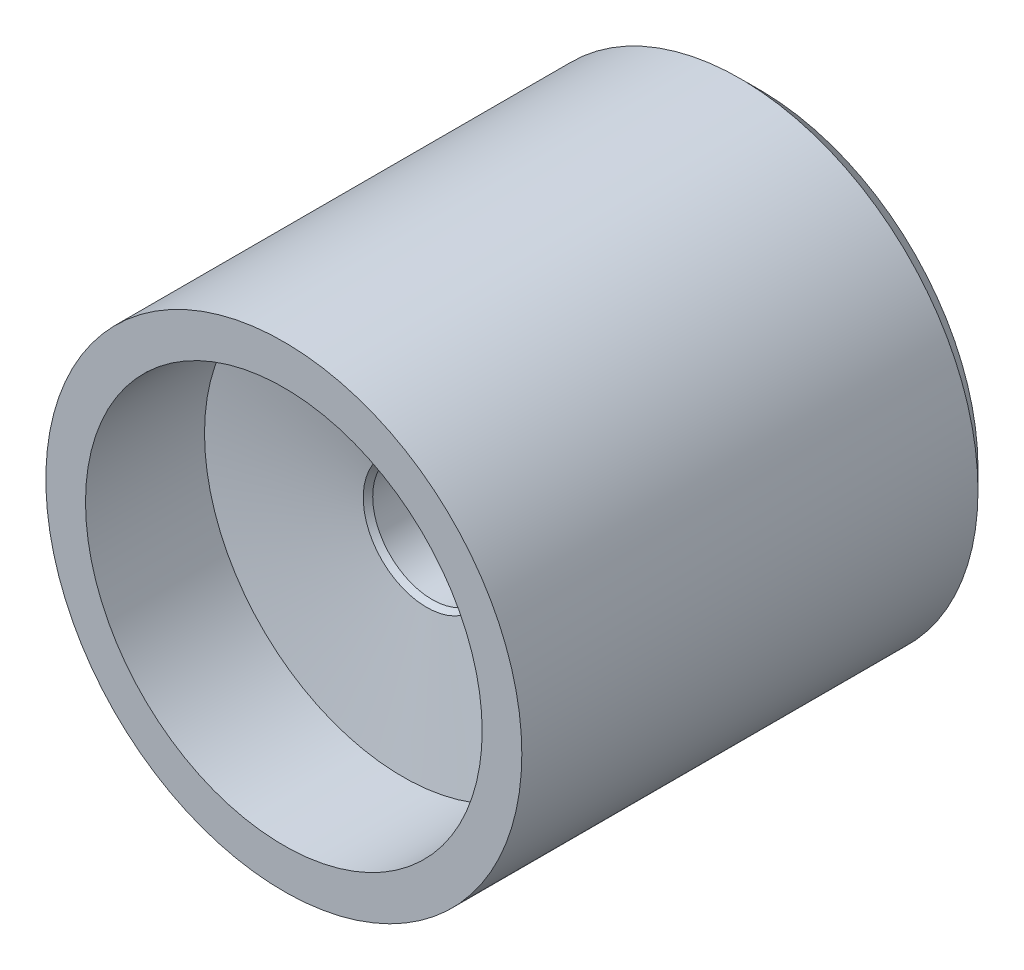
ISO-10303-21;
HEADER;
FILE_DESCRIPTION(('STEP AP214'),'2;1');
FILE_NAME('part.step','',(''),(''),'','','');
FILE_SCHEMA(('AUTOMOTIVE_DESIGN { 1 0 10303 214 1 1 1 1 }'));
ENDSEC;
DATA;
#1=APPLICATION_CONTEXT('core data for automotive mechanical design processes');
#2=APPLICATION_PROTOCOL_DEFINITION('international standard','automotive_design',2000,#1);
#3=PRODUCT_CONTEXT('',#1,'mechanical');
#4=PRODUCT('Part','Part','',(#3));
#5=PRODUCT_RELATED_PRODUCT_CATEGORY('part','',(#4));
#6=PRODUCT_DEFINITION_FORMATION('','',#4);
#7=PRODUCT_DEFINITION_CONTEXT('part definition',#1,'design');
#8=PRODUCT_DEFINITION('design','',#6,#7);
#9=PRODUCT_DEFINITION_SHAPE('','',#8);
#10=(LENGTH_UNIT() NAMED_UNIT(*) SI_UNIT(.MILLI.,.METRE.));
#11=(NAMED_UNIT(*) PLANE_ANGLE_UNIT() SI_UNIT($,.RADIAN.));
#12=(NAMED_UNIT(*) SI_UNIT($,.STERADIAN.) SOLID_ANGLE_UNIT());
#13=UNCERTAINTY_MEASURE_WITH_UNIT(LENGTH_MEASURE(1.E-05),#10,'distance_accuracy_value','');
#14=(GEOMETRIC_REPRESENTATION_CONTEXT(3) GLOBAL_UNCERTAINTY_ASSIGNED_CONTEXT((#13)) GLOBAL_UNIT_ASSIGNED_CONTEXT((#10,
#11,#12)) REPRESENTATION_CONTEXT('',''));
#15=CARTESIAN_POINT('',(0.,0.,0.));
#16=DIRECTION('',(0.,0.,1.));
#17=DIRECTION('',(1.,0.,0.));
#18=AXIS2_PLACEMENT_3D('',#15,#16,#17);
#19=CARTESIAN_POINT('',(0.,0.,12.));
#20=DIRECTION('',(0.,0.,-1.));
#21=DIRECTION('',(-1.,0.,0.));
#22=AXIS2_PLACEMENT_3D('',#19,#20,#21);
#23=CYLINDRICAL_SURFACE('',#22,6.);
#24=CARTESIAN_POINT('',(0.,0.,0.5));
#25=DIRECTION('',(0.,0.,1.));
#26=DIRECTION('',(1.,0.,0.));
#27=AXIS2_PLACEMENT_3D('',#24,#25,#26);
#28=CIRCLE('',#27,6.);
#29=CARTESIAN_POINT('',(6.,0.,0.5));
#30=VERTEX_POINT('',#29);
#31=EDGE_CURVE('E41',#30,#30,#28,.T.);
#32=ORIENTED_EDGE('',*,*,#31,.T.);
#33=EDGE_LOOP('',(#32));
#34=FACE_BOUND('',#33,.T.);
#35=CARTESIAN_POINT('',(0.,0.,12.));
#36=DIRECTION('',(0.,0.,1.));
#37=DIRECTION('',(1.,0.,0.));
#38=AXIS2_PLACEMENT_3D('',#35,#36,#37);
#39=CIRCLE('',#38,6.);
#40=CARTESIAN_POINT('',(6.,0.,12.));
#41=VERTEX_POINT('',#40);
#42=EDGE_CURVE('E54',#41,#41,#39,.T.);
#43=ORIENTED_EDGE('',*,*,#42,.F.);
#44=EDGE_LOOP('',(#43));
#45=FACE_BOUND('',#44,.T.);
#46=ADVANCED_FACE('F33',(#34,#45),#23,.T.);
#47=CARTESIAN_POINT('',(0.,0.,12.));
#48=DIRECTION('',(0.,0.,1.));
#49=DIRECTION('',(1.,0.,0.));
#50=AXIS2_PLACEMENT_3D('',#47,#48,#49);
#51=PLANE('',#50);
#52=CARTESIAN_POINT('',(0.,0.,12.));
#53=DIRECTION('',(0.,0.,1.));
#54=DIRECTION('',(1.,0.,0.));
#55=AXIS2_PLACEMENT_3D('',#52,#53,#54);
#56=CIRCLE('',#55,5.);
#57=CARTESIAN_POINT('',(5.,0.,12.));
#58=VERTEX_POINT('',#57);
#59=EDGE_CURVE('E63',#58,#58,#56,.T.);
#60=ORIENTED_EDGE('',*,*,#59,.F.);
#61=EDGE_LOOP('',(#60));
#62=FACE_BOUND('',#61,.T.);
#63=ORIENTED_EDGE('',*,*,#42,.T.);
#64=EDGE_LOOP('',(#63));
#65=FACE_BOUND('',#64,.T.);
#66=ADVANCED_FACE('F69',(#62,#65),#51,.T.);
#67=CARTESIAN_POINT('',(0.,0.,0.));
#68=DIRECTION('',(0.,0.,1.));
#69=DIRECTION('',(1.,0.,0.));
#70=AXIS2_PLACEMENT_3D('',#67,#68,#69);
#71=PLANE('',#70);
#72=CARTESIAN_POINT('',(0.,0.,0.));
#73=DIRECTION('',(0.,0.,1.));
#74=DIRECTION('',(1.,0.,0.));
#75=AXIS2_PLACEMENT_3D('',#72,#73,#74);
#76=CIRCLE('',#75,5.5);
#77=CARTESIAN_POINT('',(5.5,0.,0.));
#78=VERTEX_POINT('',#77);
#79=EDGE_CURVE('E10',#78,#78,#76,.F.);
#80=ORIENTED_EDGE('',*,*,#79,.T.);
#81=EDGE_LOOP('',(#80));
#82=FACE_BOUND('',#81,.T.);
#83=ADVANCED_FACE('F72',(#82),#71,.F.);
#84=CARTESIAN_POINT('',(0.,0.,3.5));
#85=DIRECTION('',(0.,0.,-1.));
#86=DIRECTION('',(-1.,0.,0.));
#87=AXIS2_PLACEMENT_3D('',#84,#85,#86);
#88=PLANE('',#87);
#89=CARTESIAN_POINT('',(0.,0.,3.5));
#90=DIRECTION('',(0.,0.,1.));
#91=DIRECTION('',(1.,0.,0.));
#92=AXIS2_PLACEMENT_3D('',#89,#90,#91);
#93=CIRCLE('',#92,1.5);
#94=CARTESIAN_POINT('',(1.5,0.,3.5));
#95=VERTEX_POINT('',#94);
#96=EDGE_CURVE('E57',#95,#95,#93,.T.);
#97=ORIENTED_EDGE('',*,*,#96,.T.);
#98=EDGE_LOOP('',(#97));
#99=FACE_BOUND('',#98,.T.);
#100=ADVANCED_FACE('F102',(#99),#88,.F.);
#101=CARTESIAN_POINT('',(0.,0.,12.));
#102=DIRECTION('',(0.,0.,1.));
#103=DIRECTION('',(1.,0.,0.));
#104=AXIS2_PLACEMENT_3D('',#101,#102,#103);
#105=CYLINDRICAL_SURFACE('',#104,1.5);
#106=CARTESIAN_POINT('',(0.,0.,8.25957526233819));
#107=DIRECTION('',(0.,0.,-1.));
#108=DIRECTION('',(-1.,0.,0.));
#109=AXIS2_PLACEMENT_3D('',#106,#107,#108);
#110=CIRCLE('',#109,1.5);
#111=CARTESIAN_POINT('',(-1.5,0.,8.25957526233819));
#112=VERTEX_POINT('',#111);
#113=EDGE_CURVE('E49',#112,#112,#110,.F.);
#114=ORIENTED_EDGE('',*,*,#113,.T.);
#115=EDGE_LOOP('',(#114));
#116=FACE_BOUND('',#115,.T.);
#117=ORIENTED_EDGE('',*,*,#96,.F.);
#118=EDGE_LOOP('',(#117));
#119=FACE_BOUND('',#118,.T.);
#120=ADVANCED_FACE('F99',(#116,#119),#105,.F.);
#121=CARTESIAN_POINT('',(0.,0.,9.));
#122=DIRECTION('',(0.,0.,1.));
#123=DIRECTION('',(1.,0.,0.));
#124=AXIS2_PLACEMENT_3D('',#121,#122,#123);
#125=CONICAL_SURFACE('',#124,5.,1.39626340159546);
#126=CARTESIAN_POINT('',(0.,0.,8.40022038528705));
#127=DIRECTION('',(0.,0.,-1.));
#128=DIRECTION('',(-1.,0.,0.));
#129=AXIS2_PLACEMENT_3D('',#126,#127,#128);
#130=CIRCLE('',#129,1.59848077530122);
#131=CARTESIAN_POINT('',(1.59848077530122,0.,8.40022038528705));
#132=VERTEX_POINT('',#131);
#133=EDGE_CURVE('E45',#132,#132,#130,.T.);
#134=CARTESIAN_POINT('',(0.,0.,9.));
#135=DIRECTION('',(0.,0.,1.));
#136=DIRECTION('',(1.,0.,0.));
#137=AXIS2_PLACEMENT_3D('',#134,#135,#136);
#138=CIRCLE('',#137,5.);
#139=CARTESIAN_POINT('',(4.99999999999999,0.,9.));
#140=VERTEX_POINT('',#139);
#141=EDGE_CURVE('E60',#140,#140,#138,.T.);
#142=CARTESIAN_POINT('',(1.59848077530122,0.,8.40022038528705));
#143=CARTESIAN_POINT('',(1.63391326722517,0.,8.40646808960698));
#144=CARTESIAN_POINT('',(1.66934575914912,0.,8.41271579392691));
#145=CARTESIAN_POINT('',(1.74021074299701,0.,8.42521120256676));
#146=CARTESIAN_POINT('',(1.77564323492095,0.,8.43145890688669));
#147=CARTESIAN_POINT('',(1.84650821876884,0.,8.44395431552654));
#148=CARTESIAN_POINT('',(1.88194071069279,0.,8.45020201984646));
#149=CARTESIAN_POINT('',(1.95280569454068,0.,8.46269742848632));
#150=CARTESIAN_POINT('',(1.98823818646463,0.,8.46894513280625));
#151=CARTESIAN_POINT('',(2.05910317031252,0.,8.4814405414461));
#152=CARTESIAN_POINT('',(2.09453566223646,0.,8.48768824576603));
#153=CARTESIAN_POINT('',(2.16540064608435,0.,8.50018365440588));
#154=CARTESIAN_POINT('',(2.2008331380083,0.,8.5064313587258));
#155=CARTESIAN_POINT('',(2.27169812185619,0.,8.51892676736566));
#156=CARTESIAN_POINT('',(2.30713061378014,0.,8.52517447168558));
#157=CARTESIAN_POINT('',(2.37799559762803,0.,8.53766988032544));
#158=CARTESIAN_POINT('',(2.41342808955197,0.,8.54391758464536));
#159=CARTESIAN_POINT('',(2.48429307339986,0.,8.55641299328522));
#160=CARTESIAN_POINT('',(2.51972556532381,0.,8.56266069760514));
#161=CARTESIAN_POINT('',(2.5905905491717,0.,8.575156106245));
#162=CARTESIAN_POINT('',(2.62602304109564,0.,8.58140381056492));
#163=CARTESIAN_POINT('',(2.69688802494354,0.,8.59389921920477));
#164=CARTESIAN_POINT('',(2.73232051686748,0.,8.6001469235247));
#165=CARTESIAN_POINT('',(2.80318550071537,0.,8.61264233216455));
#166=CARTESIAN_POINT('',(2.83861799263932,0.,8.61889003648448));
#167=CARTESIAN_POINT('',(2.90948297648721,0.,8.63138544512434));
#168=CARTESIAN_POINT('',(2.94491546841115,0.,8.63763314944426));
#169=CARTESIAN_POINT('',(3.01578045225905,0.,8.65012855808411));
#170=CARTESIAN_POINT('',(3.05121294418299,0.,8.65637626240404));
#171=CARTESIAN_POINT('',(3.12207792803088,0.,8.66887167104389));
#172=CARTESIAN_POINT('',(3.15751041995483,0.,8.67511937536382));
#173=CARTESIAN_POINT('',(3.22837540380272,0.,8.68761478400367));
#174=CARTESIAN_POINT('',(3.26380789572666,0.,8.6938624883236));
#175=CARTESIAN_POINT('',(3.33467287957455,0.,8.70635789696345));
#176=CARTESIAN_POINT('',(3.3701053714985,0.,8.71260560128338));
#177=CARTESIAN_POINT('',(3.44097035534639,0.,8.72510100992323));
#178=CARTESIAN_POINT('',(3.47640284727034,0.,8.73134871424316));
#179=CARTESIAN_POINT('',(3.54726783111823,0.,8.74384412288301));
#180=CARTESIAN_POINT('',(3.58270032304217,0.,8.75009182720294));
#181=CARTESIAN_POINT('',(3.65356530689006,0.,8.76258723584279));
#182=CARTESIAN_POINT('',(3.68899779881401,0.,8.76883494016272));
#183=CARTESIAN_POINT('',(3.7598627826619,0.,8.78133034880257));
#184=CARTESIAN_POINT('',(3.79529527458585,0.,8.7875780531225));
#185=CARTESIAN_POINT('',(3.86616025843374,0.,8.80007346176235));
#186=CARTESIAN_POINT('',(3.90159275035768,0.,8.80632116608228));
#187=CARTESIAN_POINT('',(3.97245773420558,0.,8.81881657472213));
#188=CARTESIAN_POINT('',(4.00789022612952,0.,8.82506427904206));
#189=CARTESIAN_POINT('',(4.07875520997741,0.,8.83755968768191));
#190=CARTESIAN_POINT('',(4.11418770190136,0.,8.84380739200184));
#191=CARTESIAN_POINT('',(4.18505268574925,0.,8.85630280064169));
#192=CARTESIAN_POINT('',(4.22048517767319,0.,8.86255050496162));
#193=CARTESIAN_POINT('',(4.29135016152108,0.,8.87504591360147));
#194=CARTESIAN_POINT('',(4.32678265344503,0.,8.8812936179214));
#195=CARTESIAN_POINT('',(4.39764763729292,0.,8.89378902656125));
#196=CARTESIAN_POINT('',(4.43308012921687,0.,8.90003673088118));
#197=CARTESIAN_POINT('',(4.50394511306476,0.,8.91253213952103));
#198=CARTESIAN_POINT('',(4.5393776049887,0.,8.91877984384096));
#199=CARTESIAN_POINT('',(4.61024258883659,0.,8.93127525248081));
#200=CARTESIAN_POINT('',(4.64567508076054,0.,8.93752295680074));
#201=CARTESIAN_POINT('',(4.71654006460843,0.,8.95001836544059));
#202=CARTESIAN_POINT('',(4.75197255653238,0.,8.95626606976052));
#203=CARTESIAN_POINT('',(4.82283754038027,0.,8.96876147840037));
#204=CARTESIAN_POINT('',(4.85827003230421,0.,8.9750091827203));
#205=CARTESIAN_POINT('',(4.9291350161521,0.,8.98750459136015));
#206=CARTESIAN_POINT('',(4.96456750807605,0.,8.99375229568008));
#207=CARTESIAN_POINT('',(4.99999999999999,0.,9.));
#208=B_SPLINE_CURVE_WITH_KNOTS('',3,(#142,#143,#144,#145,#146,#147,#148,#149,#150,#151,#152,
#153,#154,#155,#156,#157,#158,#159,#160,#161,#162,#163,#164,#165,#166,#167,#168,#169,#170,#171,
#172,#173,#174,#175,#176,#177,#178,#179,#180,#181,#182,#183,#184,#185,#186,#187,#188,#189,#190,
#191,#192,#193,#194,#195,#196,#197,#198,#199,#200,#201,#202,#203,#204,#205,#206,#207),
.UNSPECIFIED.,.F.,.F.,(4,2,2,2,2,2,2,2,2,2,2,2,2,2,2,2,2,2,2,2,2,2,2,2,2,2,2,2,2,2,2,2,4),(0.,
0.107937285675004,0.215874571350007,0.323811857025009,0.431749142700013,0.539686428375016,
0.647623714050019,0.755560999725022,0.863498285400025,0.971435571075029,1.07937285675003,
1.18731014242503,1.29524742810004,1.40318471377504,1.51112199945004,1.61905928512505,
1.72699657080005,1.83493385647505,1.94287114215006,2.05080842782506,2.15874571350006,
2.26668299917507,2.37462028485007,2.48255757052507,2.59049485620008,2.69843214187508,
2.80636942755008,2.91430671322509,3.02224399890009,3.13018128457509,3.2381185702501,
3.3460558559251,3.4539931416001),.UNSPECIFIED.);
#209=EDGE_CURVE('BSEAM92',#132,#140,#208,.T.);
#210=ORIENTED_EDGE('',*,*,#133,.T.);
#211=ORIENTED_EDGE('',*,*,#141,.T.);
#212=ORIENTED_EDGE('',*,*,#209,.T.);
#213=ORIENTED_EDGE('',*,*,#209,.F.);
#214=EDGE_LOOP('',(#210,#212,#211,#213));
#215=FACE_BOUND('',#214,.T.);
#216=ADVANCED_FACE('F92',(#215),#125,.F.);
#217=CARTESIAN_POINT('',(0.,0.,12.));
#218=DIRECTION('',(0.,0.,1.));
#219=DIRECTION('',(1.,0.,0.));
#220=AXIS2_PLACEMENT_3D('',#217,#218,#219);
#221=CYLINDRICAL_SURFACE('',#220,5.);
#222=ORIENTED_EDGE('',*,*,#141,.F.);
#223=EDGE_LOOP('',(#222));
#224=FACE_BOUND('',#223,.T.);
#225=ORIENTED_EDGE('',*,*,#59,.T.);
#226=EDGE_LOOP('',(#225));
#227=FACE_BOUND('',#226,.T.);
#228=ADVANCED_FACE('F67',(#224,#227),#221,.F.);
#229=CARTESIAN_POINT('',(0.,0.,8.25957526233819));
#230=DIRECTION('',(0.,0.,1.));
#231=DIRECTION('',(1.,0.,0.));
#232=AXIS2_PLACEMENT_3D('',#229,#230,#231);
#233=CONICAL_SURFACE('',#232,1.5,0.610865238198004);
#234=ORIENTED_EDGE('',*,*,#133,.F.);
#235=EDGE_LOOP('',(#234));
#236=FACE_BOUND('',#235,.T.);
#237=ORIENTED_EDGE('',*,*,#113,.F.);
#238=EDGE_LOOP('',(#237));
#239=FACE_BOUND('',#238,.T.);
#240=ADVANCED_FACE('F82',(#236,#239),#233,.F.);
#241=CARTESIAN_POINT('',(0.,0.,0.5));
#242=DIRECTION('',(0.,0.,1.));
#243=DIRECTION('',(1.,0.,0.));
#244=AXIS2_PLACEMENT_3D('',#241,#242,#243);
#245=CONICAL_SURFACE('',#244,6.,0.78539816339745);
#246=ORIENTED_EDGE('',*,*,#79,.F.);
#247=EDGE_LOOP('',(#246));
#248=FACE_BOUND('',#247,.T.);
#249=ORIENTED_EDGE('',*,*,#31,.F.);
#250=EDGE_LOOP('',(#249));
#251=FACE_BOUND('',#250,.T.);
#252=ADVANCED_FACE('F36',(#248,#251),#245,.T.);
#253=CLOSED_SHELL('',(#46,#66,#83,#100,#120,#216,#228,#240,#252));
#254=MANIFOLD_SOLID_BREP('B2',#253);
#255=ADVANCED_BREP_SHAPE_REPRESENTATION('',(#18,#254),#14);
#256=SHAPE_DEFINITION_REPRESENTATION(#9,#255);
ENDSEC;
END-ISO-10303-21;
